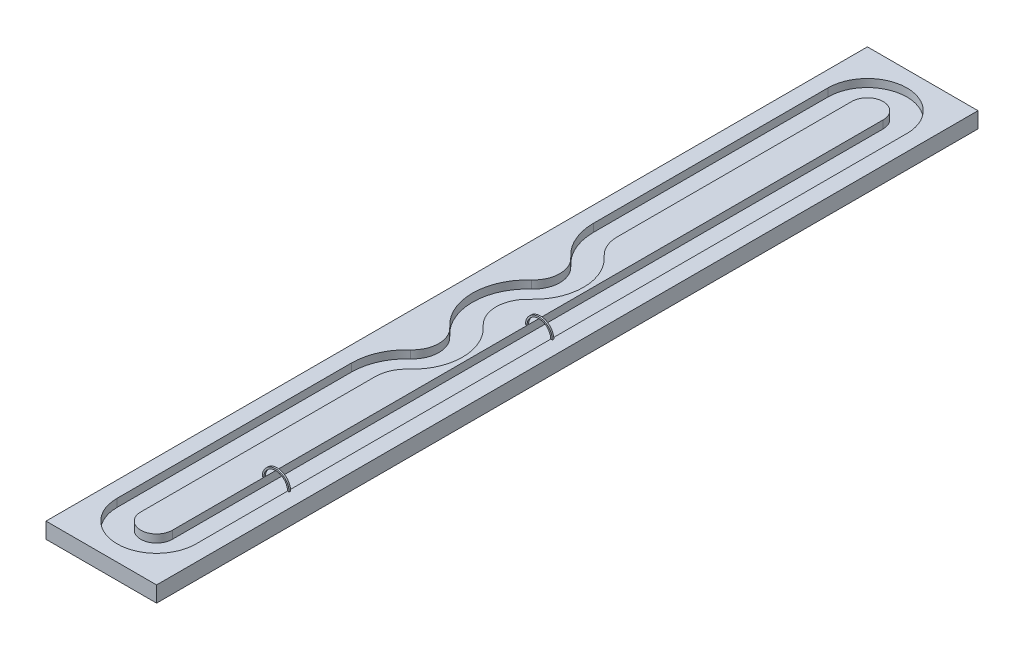
ISO-10303-21;
HEADER;
FILE_DESCRIPTION(('STEP AP214'),'2;1');
FILE_NAME('part.step','',(''),(''),'','','');
FILE_SCHEMA(('AUTOMOTIVE_DESIGN { 1 0 10303 214 1 1 1 1 }'));
ENDSEC;
DATA;
#1=APPLICATION_CONTEXT('core data for automotive mechanical design processes');
#2=APPLICATION_PROTOCOL_DEFINITION('international standard','automotive_design',2000,#1);
#3=PRODUCT_CONTEXT('',#1,'mechanical');
#4=PRODUCT('Part','Part','',(#3));
#5=PRODUCT_RELATED_PRODUCT_CATEGORY('part','',(#4));
#6=PRODUCT_DEFINITION_FORMATION('','',#4);
#7=PRODUCT_DEFINITION_CONTEXT('part definition',#1,'design');
#8=PRODUCT_DEFINITION('design','',#6,#7);
#9=PRODUCT_DEFINITION_SHAPE('','',#8);
#10=(LENGTH_UNIT() NAMED_UNIT(*) SI_UNIT(.MILLI.,.METRE.));
#11=(NAMED_UNIT(*) PLANE_ANGLE_UNIT() SI_UNIT($,.RADIAN.));
#12=(NAMED_UNIT(*) SI_UNIT($,.STERADIAN.) SOLID_ANGLE_UNIT());
#13=UNCERTAINTY_MEASURE_WITH_UNIT(LENGTH_MEASURE(1.E-05),#10,'distance_accuracy_value','');
#14=(GEOMETRIC_REPRESENTATION_CONTEXT(3) GLOBAL_UNCERTAINTY_ASSIGNED_CONTEXT((#13)) GLOBAL_UNIT_ASSIGNED_CONTEXT((#10,
#11,#12)) REPRESENTATION_CONTEXT('',''));
#15=CARTESIAN_POINT('',(0.,0.,0.));
#16=DIRECTION('',(0.,0.,1.));
#17=DIRECTION('',(1.,0.,0.));
#18=AXIS2_PLACEMENT_3D('',#15,#16,#17);
#19=CARTESIAN_POINT('',(-3500.00000000001,500.,-51000.));
#20=DIRECTION('',(1.,0.,0.));
#21=DIRECTION('',(0.,0.,-1.));
#22=AXIS2_PLACEMENT_3D('',#19,#20,#21);
#23=PLANE('',#22);
#24=DIRECTION('',(0.,0.,1.));
#25=VECTOR('',#24,1.);
#26=CARTESIAN_POINT('',(-3500.00000000001,-500.,-51000.));
#27=LINE('',#26,#25);
#28=CARTESIAN_POINT('',(-3500.00000000001,-500.,-51000.));
#29=VERTEX_POINT('',#28);
#30=CARTESIAN_POINT('',(-3500.,-500.,1000.));
#31=VERTEX_POINT('',#30);
#32=EDGE_CURVE('E393',#29,#31,#27,.T.);
#33=ORIENTED_EDGE('',*,*,#32,.T.);
#34=DIRECTION('',(0.,-1.,0.));
#35=VECTOR('',#34,1.);
#36=CARTESIAN_POINT('',(-3500.,500.,1000.));
#37=LINE('',#36,#35);
#38=CARTESIAN_POINT('',(-3500.,500.,1000.));
#39=VERTEX_POINT('',#38);
#40=EDGE_CURVE('E11',#39,#31,#37,.T.);
#41=ORIENTED_EDGE('',*,*,#40,.F.);
#42=DIRECTION('',(0.,0.,1.));
#43=VECTOR('',#42,1.);
#44=CARTESIAN_POINT('',(-3500.00000000001,500.,-51000.));
#45=LINE('',#44,#43);
#46=CARTESIAN_POINT('',(-3500.00000000001,500.,-51000.));
#47=VERTEX_POINT('',#46);
#48=EDGE_CURVE('E413',#47,#39,#45,.T.);
#49=ORIENTED_EDGE('',*,*,#48,.F.);
#50=DIRECTION('',(0.,-1.,0.));
#51=VECTOR('',#50,1.);
#52=CARTESIAN_POINT('',(-3500.00000000001,500.,-51000.));
#53=LINE('',#52,#51);
#54=EDGE_CURVE('E423',#47,#29,#53,.T.);
#55=ORIENTED_EDGE('',*,*,#54,.T.);
#56=EDGE_LOOP('',(#33,#41,#49,#55));
#57=FACE_BOUND('',#56,.T.);
#58=ADVANCED_FACE('F33',(#57),#23,.F.);
#59=CARTESIAN_POINT('',(-3500.,500.,1000.));
#60=DIRECTION('',(0.,0.,-1.));
#61=DIRECTION('',(-1.,0.,0.));
#62=AXIS2_PLACEMENT_3D('',#59,#60,#61);
#63=PLANE('',#62);
#64=DIRECTION('',(1.,0.,0.));
#65=VECTOR('',#64,1.);
#66=CARTESIAN_POINT('',(-3500.,-500.,1000.));
#67=LINE('',#66,#65);
#68=CARTESIAN_POINT('',(3500.,-500.,1000.));
#69=VERTEX_POINT('',#68);
#70=EDGE_CURVE('E426',#31,#69,#67,.T.);
#71=ORIENTED_EDGE('',*,*,#70,.T.);
#72=DIRECTION('',(0.,-1.,0.));
#73=VECTOR('',#72,1.);
#74=CARTESIAN_POINT('',(3500.,500.,1000.));
#75=LINE('',#74,#73);
#76=CARTESIAN_POINT('',(3500.,500.,1000.));
#77=VERTEX_POINT('',#76);
#78=EDGE_CURVE('E40',#77,#69,#75,.T.);
#79=ORIENTED_EDGE('',*,*,#78,.F.);
#80=DIRECTION('',(1.,0.,0.));
#81=VECTOR('',#80,1.);
#82=CARTESIAN_POINT('',(-3500.,500.,1000.));
#83=LINE('',#82,#81);
#84=EDGE_CURVE('E416',#39,#77,#83,.T.);
#85=ORIENTED_EDGE('',*,*,#84,.F.);
#86=ORIENTED_EDGE('',*,*,#40,.T.);
#87=EDGE_LOOP('',(#71,#79,#85,#86));
#88=FACE_BOUND('',#87,.T.);
#89=ADVANCED_FACE('F456',(#88),#63,.F.);
#90=CARTESIAN_POINT('',(3500.00000000001,500.,-51000.));
#91=DIRECTION('',(-1.,0.,0.));
#92=DIRECTION('',(0.,0.,1.));
#93=AXIS2_PLACEMENT_3D('',#90,#91,#92);
#94=PLANE('',#93);
#95=DIRECTION('',(0.,0.,-1.));
#96=VECTOR('',#95,1.);
#97=CARTESIAN_POINT('',(3500.00000000001,-500.,-51000.));
#98=LINE('',#97,#96);
#99=CARTESIAN_POINT('',(3500.00000000001,-500.,-51000.));
#100=VERTEX_POINT('',#99);
#101=EDGE_CURVE('E428',#69,#100,#98,.T.);
#102=ORIENTED_EDGE('',*,*,#101,.T.);
#103=DIRECTION('',(0.,-1.,0.));
#104=VECTOR('',#103,1.);
#105=CARTESIAN_POINT('',(3500.00000000001,500.,-51000.));
#106=LINE('',#105,#104);
#107=CARTESIAN_POINT('',(3500.00000000001,500.,-51000.));
#108=VERTEX_POINT('',#107);
#109=EDGE_CURVE('E433',#108,#100,#106,.T.);
#110=ORIENTED_EDGE('',*,*,#109,.F.);
#111=DIRECTION('',(0.,0.,-1.));
#112=VECTOR('',#111,1.);
#113=CARTESIAN_POINT('',(3500.00000000001,500.,-51000.));
#114=LINE('',#113,#112);
#115=EDGE_CURVE('E419',#77,#108,#114,.T.);
#116=ORIENTED_EDGE('',*,*,#115,.F.);
#117=ORIENTED_EDGE('',*,*,#78,.T.);
#118=EDGE_LOOP('',(#102,#110,#116,#117));
#119=FACE_BOUND('',#118,.T.);
#120=ADVANCED_FACE('F440',(#119),#94,.F.);
#121=CARTESIAN_POINT('',(-3500.00000000001,500.,-51000.));
#122=DIRECTION('',(0.,0.,1.));
#123=DIRECTION('',(1.,0.,0.));
#124=AXIS2_PLACEMENT_3D('',#121,#122,#123);
#125=PLANE('',#124);
#126=DIRECTION('',(-1.,0.,0.));
#127=VECTOR('',#126,1.);
#128=CARTESIAN_POINT('',(-3500.00000000001,-500.,-51000.));
#129=LINE('',#128,#127);
#130=EDGE_CURVE('E417',#100,#29,#129,.T.);
#131=ORIENTED_EDGE('',*,*,#130,.T.);
#132=ORIENTED_EDGE('',*,*,#54,.F.);
#133=DIRECTION('',(-1.,0.,0.));
#134=VECTOR('',#133,1.);
#135=CARTESIAN_POINT('',(-3500.00000000001,500.,-51000.));
#136=LINE('',#135,#134);
#137=EDGE_CURVE('E421',#108,#47,#136,.T.);
#138=ORIENTED_EDGE('',*,*,#137,.F.);
#139=ORIENTED_EDGE('',*,*,#109,.T.);
#140=EDGE_LOOP('',(#131,#132,#138,#139));
#141=FACE_BOUND('',#140,.T.);
#142=ADVANCED_FACE('F449',(#141),#125,.F.);
#143=CARTESIAN_POINT('',(0.,500.,0.));
#144=DIRECTION('',(0.,1.,0.));
#145=DIRECTION('',(0.,0.,1.));
#146=AXIS2_PLACEMENT_3D('',#143,#144,#145);
#147=PLANE('',#146);
#148=DIRECTION('',(-1.,0.,0.));
#149=VECTOR('',#148,1.);
#150=CARTESIAN_POINT('',(2600.00000000016,500.,-8390.00000000002));
#151=LINE('',#150,#149);
#152=CARTESIAN_POINT('',(2600.00000000016,500.,-8390.00000000002));
#153=VERTEX_POINT('',#152);
#154=CARTESIAN_POINT('',(2500.,500.,-8390.00000000002));
#155=VERTEX_POINT('',#154);
#156=EDGE_CURVE('E244',#153,#155,#151,.T.);
#157=ORIENTED_EDGE('',*,*,#156,.F.);
#158=DIRECTION('',(0.,0.,1.));
#159=VECTOR('',#158,1.);
#160=CARTESIAN_POINT('',(2600.00000000016,500.,-8390.00000000002));
#161=LINE('',#160,#159);
#162=CARTESIAN_POINT('',(2600.00000000016,500.,-8290.00000000002));
#163=VERTEX_POINT('',#162);
#164=EDGE_CURVE('E801',#153,#163,#161,.T.);
#165=ORIENTED_EDGE('',*,*,#164,.T.);
#166=DIRECTION('',(-1.,0.,0.));
#167=VECTOR('',#166,1.);
#168=CARTESIAN_POINT('',(2600.00000000016,500.,-8290.00000000002));
#169=LINE('',#168,#167);
#170=CARTESIAN_POINT('',(2500.00000000016,500.,-8290.00000000002));
#171=VERTEX_POINT('',#170);
#172=EDGE_CURVE('E246',#163,#171,#169,.T.);
#173=ORIENTED_EDGE('',*,*,#172,.T.);
#174=DIRECTION('',(0.,0.,-1.));
#175=VECTOR('',#174,1.);
#176=CARTESIAN_POINT('',(2500.,500.,-2500.));
#177=LINE('',#176,#175);
#178=CARTESIAN_POINT('',(2500.,500.,-2500.));
#179=VERTEX_POINT('',#178);
#180=EDGE_CURVE('E364',#179,#171,#177,.T.);
#181=ORIENTED_EDGE('',*,*,#180,.F.);
#182=CARTESIAN_POINT('',(0.,500.,-2500.));
#183=DIRECTION('',(0.,1.,0.));
#184=DIRECTION('',(0.,0.,1.));
#185=AXIS2_PLACEMENT_3D('',#182,#183,#184);
#186=CIRCLE('',#185,2500.);
#187=CARTESIAN_POINT('',(-2500.,500.,-2500.));
#188=VERTEX_POINT('',#187);
#189=EDGE_CURVE('E309',#188,#179,#186,.T.);
#190=ORIENTED_EDGE('',*,*,#189,.F.);
#191=DIRECTION('',(0.,0.,1.));
#192=VECTOR('',#191,1.);
#193=CARTESIAN_POINT('',(-2500.,500.,-17340.));
#194=LINE('',#193,#192);
#195=CARTESIAN_POINT('',(-2500.,500.,-17340.));
#196=VERTEX_POINT('',#195);
#197=EDGE_CURVE('E334',#196,#188,#194,.T.);
#198=ORIENTED_EDGE('',*,*,#197,.F.);
#199=CARTESIAN_POINT('',(991.895086607276,500.,-17340.));
#200=DIRECTION('',(0.,1.,0.));
#201=DIRECTION('',(0.,0.,1.));
#202=AXIS2_PLACEMENT_3D('',#199,#200,#201);
#203=CIRCLE('',#202,3491.89508660727);
#204=CARTESIAN_POINT('',(-1352.10190587398,500.,-19928.2444620072));
#205=VERTEX_POINT('',#204);
#206=EDGE_CURVE('E386',#205,#196,#203,.T.);
#207=ORIENTED_EDGE('',*,*,#206,.F.);
#208=CARTESIAN_POINT('',(-2476.67544951634,500.,-21170.));
#209=DIRECTION('',(0.,-1.,0.));
#210=DIRECTION('',(0.,0.,-1.));
#211=AXIS2_PLACEMENT_3D('',#208,#209,#210);
#212=CIRCLE('',#211,1675.29772613592);
#213=CARTESIAN_POINT('',(-1352.10190587398,500.,-22411.7555379928));
#214=VERTEX_POINT('',#213);
#215=EDGE_CURVE('E383',#214,#205,#212,.T.);
#216=ORIENTED_EDGE('',*,*,#215,.F.);
#217=CARTESIAN_POINT('',(991.895086607281,500.,-25000.));
#218=DIRECTION('',(0.,1.,0.));
#219=DIRECTION('',(0.,0.,1.));
#220=AXIS2_PLACEMENT_3D('',#217,#218,#219);
#221=CIRCLE('',#220,3491.89508660728);
#222=CARTESIAN_POINT('',(-1352.10190587398,500.,-27588.2444620072));
#223=VERTEX_POINT('',#222);
#224=EDGE_CURVE('E380',#223,#214,#221,.T.);
#225=ORIENTED_EDGE('',*,*,#224,.F.);
#226=CARTESIAN_POINT('',(-2476.67544951634,500.,-28830.));
#227=DIRECTION('',(0.,-1.,0.));
#228=DIRECTION('',(0.,0.,-1.));
#229=AXIS2_PLACEMENT_3D('',#226,#227,#228);
#230=CIRCLE('',#229,1675.29772613592);
#231=CARTESIAN_POINT('',(-1352.10190587398,500.,-30071.7555379928));
#232=VERTEX_POINT('',#231);
#233=EDGE_CURVE('E377',#232,#223,#230,.T.);
#234=ORIENTED_EDGE('',*,*,#233,.F.);
#235=CARTESIAN_POINT('',(991.895086607304,500.,-32660.));
#236=DIRECTION('',(0.,1.,0.));
#237=DIRECTION('',(0.,0.,1.));
#238=AXIS2_PLACEMENT_3D('',#235,#236,#237);
#239=CIRCLE('',#238,3491.89508660731);
#240=CARTESIAN_POINT('',(-2500.,500.,-32660.));
#241=VERTEX_POINT('',#240);
#242=EDGE_CURVE('E374',#241,#232,#239,.T.);
#243=ORIENTED_EDGE('',*,*,#242,.F.);
#244=DIRECTION('',(0.,0.,1.));
#245=VECTOR('',#244,1.);
#246=CARTESIAN_POINT('',(-2500.,500.,-47500.));
#247=LINE('',#246,#245);
#248=CARTESIAN_POINT('',(-2500.,500.,-47500.));
#249=VERTEX_POINT('',#248);
#250=EDGE_CURVE('E371',#249,#241,#247,.T.);
#251=ORIENTED_EDGE('',*,*,#250,.F.);
#252=CARTESIAN_POINT('',(-3.99680288865056E-12,500.,-47500.));
#253=DIRECTION('',(0.,1.,0.));
#254=DIRECTION('',(0.,0.,1.));
#255=AXIS2_PLACEMENT_3D('',#252,#253,#254);
#256=CIRCLE('',#255,2500.);
#257=CARTESIAN_POINT('',(2500.,500.,-47500.));
#258=VERTEX_POINT('',#257);
#259=EDGE_CURVE('E367',#258,#249,#256,.T.);
#260=ORIENTED_EDGE('',*,*,#259,.F.);
#261=CARTESIAN_POINT('',(2500.,500.,-25050.));
#262=VERTEX_POINT('',#261);
#263=EDGE_CURVE('E363',#262,#258,#177,.T.);
#264=ORIENTED_EDGE('',*,*,#263,.F.);
#265=DIRECTION('',(-1.,0.,0.));
#266=VECTOR('',#265,1.);
#267=CARTESIAN_POINT('',(2600.00000000015,500.,-25050.));
#268=LINE('',#267,#266);
#269=CARTESIAN_POINT('',(2600.00000000015,500.,-25050.));
#270=VERTEX_POINT('',#269);
#271=EDGE_CURVE('E834',#270,#262,#268,.T.);
#272=ORIENTED_EDGE('',*,*,#271,.F.);
#273=DIRECTION('',(0.,0.,1.));
#274=VECTOR('',#273,1.);
#275=CARTESIAN_POINT('',(2600.00000000015,500.,-25050.));
#276=LINE('',#275,#274);
#277=CARTESIAN_POINT('',(2600.00000000015,500.,-24950.));
#278=VERTEX_POINT('',#277);
#279=EDGE_CURVE('E833',#270,#278,#276,.T.);
#280=ORIENTED_EDGE('',*,*,#279,.T.);
#281=DIRECTION('',(-1.,0.,0.));
#282=VECTOR('',#281,1.);
#283=CARTESIAN_POINT('',(2600.00000000015,500.,-24950.));
#284=LINE('',#283,#282);
#285=CARTESIAN_POINT('',(2500.00000000015,500.,-24950.));
#286=VERTEX_POINT('',#285);
#287=EDGE_CURVE('E837',#278,#286,#284,.T.);
#288=ORIENTED_EDGE('',*,*,#287,.T.);
#289=EDGE_CURVE('E368',#155,#286,#177,.T.);
#290=ORIENTED_EDGE('',*,*,#289,.F.);
#291=EDGE_LOOP('',(#157,#165,#173,#181,#190,#198,#207,#216,#225,#234,#243,#251,#260,#264,#272,
#280,#288,#290));
#292=FACE_BOUND('',#291,.T.);
#293=ORIENTED_EDGE('',*,*,#48,.T.);
#294=ORIENTED_EDGE('',*,*,#84,.T.);
#295=ORIENTED_EDGE('',*,*,#115,.T.);
#296=ORIENTED_EDGE('',*,*,#137,.T.);
#297=EDGE_LOOP('',(#293,#294,#295,#296));
#298=FACE_BOUND('',#297,.T.);
#299=ADVANCED_FACE('F455',(#292,#298),#147,.T.);
#300=CARTESIAN_POINT('',(0.,-500.,0.));
#301=DIRECTION('',(0.,1.,0.));
#302=DIRECTION('',(0.,0.,1.));
#303=AXIS2_PLACEMENT_3D('',#300,#301,#302);
#304=PLANE('',#303);
#305=ORIENTED_EDGE('',*,*,#32,.F.);
#306=ORIENTED_EDGE('',*,*,#130,.F.);
#307=ORIENTED_EDGE('',*,*,#101,.F.);
#308=ORIENTED_EDGE('',*,*,#70,.F.);
#309=EDGE_LOOP('',(#305,#306,#307,#308));
#310=FACE_BOUND('',#309,.T.);
#311=ADVANCED_FACE('F446',(#310),#304,.F.);
#312=CARTESIAN_POINT('',(0.,0.,-2500.));
#313=DIRECTION('',(0.,1.,0.));
#314=DIRECTION('',(0.,0.,1.));
#315=AXIS2_PLACEMENT_3D('',#312,#313,#314);
#316=CYLINDRICAL_SURFACE('',#315,2500.);
#317=ORIENTED_EDGE('',*,*,#189,.T.);
#318=DIRECTION('',(0.,1.,0.));
#319=VECTOR('',#318,1.);
#320=CARTESIAN_POINT('',(2500.,0.,-2500.));
#321=LINE('',#320,#319);
#322=CARTESIAN_POINT('',(2500.,0.,-2500.));
#323=VERTEX_POINT('',#322);
#324=EDGE_CURVE('E361',#323,#179,#321,.T.);
#325=ORIENTED_EDGE('',*,*,#324,.F.);
#326=CARTESIAN_POINT('',(0.,0.,-2500.));
#327=DIRECTION('',(0.,1.,0.));
#328=DIRECTION('',(0.,0.,1.));
#329=AXIS2_PLACEMENT_3D('',#326,#327,#328);
#330=CIRCLE('',#329,2500.);
#331=CARTESIAN_POINT('',(-2500.,0.,-2500.));
#332=VERTEX_POINT('',#331);
#333=EDGE_CURVE('E330',#332,#323,#330,.T.);
#334=ORIENTED_EDGE('',*,*,#333,.F.);
#335=DIRECTION('',(0.,1.,0.));
#336=VECTOR('',#335,1.);
#337=CARTESIAN_POINT('',(-2500.,0.,-2500.));
#338=LINE('',#337,#336);
#339=EDGE_CURVE('E391',#332,#188,#338,.T.);
#340=ORIENTED_EDGE('',*,*,#339,.T.);
#341=EDGE_LOOP('',(#317,#325,#334,#340));
#342=FACE_BOUND('',#341,.T.);
#343=ADVANCED_FACE('F468',(#342),#316,.F.);
#344=CARTESIAN_POINT('',(-2500.,0.,-17340.));
#345=DIRECTION('',(-1.,0.,0.));
#346=DIRECTION('',(0.,0.,1.));
#347=AXIS2_PLACEMENT_3D('',#344,#345,#346);
#348=PLANE('',#347);
#349=ORIENTED_EDGE('',*,*,#197,.T.);
#350=ORIENTED_EDGE('',*,*,#339,.F.);
#351=DIRECTION('',(0.,0.,1.));
#352=VECTOR('',#351,1.);
#353=CARTESIAN_POINT('',(-2500.,0.,-17340.));
#354=LINE('',#353,#352);
#355=CARTESIAN_POINT('',(-2500.,0.,-17340.));
#356=VERTEX_POINT('',#355);
#357=EDGE_CURVE('E358',#356,#332,#354,.T.);
#358=ORIENTED_EDGE('',*,*,#357,.F.);
#359=DIRECTION('',(0.,1.,0.));
#360=VECTOR('',#359,1.);
#361=CARTESIAN_POINT('',(-2500.,0.,-17340.));
#362=LINE('',#361,#360);
#363=EDGE_CURVE('E394',#356,#196,#362,.T.);
#364=ORIENTED_EDGE('',*,*,#363,.T.);
#365=EDGE_LOOP('',(#349,#350,#358,#364));
#366=FACE_BOUND('',#365,.T.);
#367=ADVANCED_FACE('F474',(#366),#348,.F.);
#368=CARTESIAN_POINT('',(991.895086607276,0.,-17340.));
#369=DIRECTION('',(0.,1.,0.));
#370=DIRECTION('',(0.,0.,1.));
#371=AXIS2_PLACEMENT_3D('',#368,#369,#370);
#372=CYLINDRICAL_SURFACE('',#371,3491.89508660727);
#373=ORIENTED_EDGE('',*,*,#206,.T.);
#374=ORIENTED_EDGE('',*,*,#363,.F.);
#375=CARTESIAN_POINT('',(991.895086607276,0.,-17340.));
#376=DIRECTION('',(0.,1.,0.));
#377=DIRECTION('',(0.,0.,1.));
#378=AXIS2_PLACEMENT_3D('',#375,#376,#377);
#379=CIRCLE('',#378,3491.89508660727);
#380=CARTESIAN_POINT('',(-1352.10190587398,0.,-19928.2444620072));
#381=VERTEX_POINT('',#380);
#382=EDGE_CURVE('E355',#381,#356,#379,.T.);
#383=ORIENTED_EDGE('',*,*,#382,.F.);
#384=DIRECTION('',(0.,1.,0.));
#385=VECTOR('',#384,1.);
#386=CARTESIAN_POINT('',(-1352.10190587398,0.,-19928.2444620072));
#387=LINE('',#386,#385);
#388=EDGE_CURVE('E396',#381,#205,#387,.T.);
#389=ORIENTED_EDGE('',*,*,#388,.T.);
#390=EDGE_LOOP('',(#373,#374,#383,#389));
#391=FACE_BOUND('',#390,.T.);
#392=ADVANCED_FACE('F504',(#391),#372,.F.);
#393=CARTESIAN_POINT('',(-2476.67544951634,0.,-21170.));
#394=DIRECTION('',(0.,1.,0.));
#395=DIRECTION('',(0.,0.,1.));
#396=AXIS2_PLACEMENT_3D('',#393,#394,#395);
#397=CYLINDRICAL_SURFACE('',#396,1675.29772613592);
#398=ORIENTED_EDGE('',*,*,#215,.T.);
#399=ORIENTED_EDGE('',*,*,#388,.F.);
#400=CARTESIAN_POINT('',(-2476.67544951634,0.,-21170.));
#401=DIRECTION('',(0.,-1.,0.));
#402=DIRECTION('',(0.,0.,-1.));
#403=AXIS2_PLACEMENT_3D('',#400,#401,#402);
#404=CIRCLE('',#403,1675.29772613592);
#405=CARTESIAN_POINT('',(-1352.10190587398,0.,-22411.7555379928));
#406=VERTEX_POINT('',#405);
#407=EDGE_CURVE('E352',#406,#381,#404,.T.);
#408=ORIENTED_EDGE('',*,*,#407,.F.);
#409=DIRECTION('',(0.,1.,0.));
#410=VECTOR('',#409,1.);
#411=CARTESIAN_POINT('',(-1352.10190587398,0.,-22411.7555379928));
#412=LINE('',#411,#410);
#413=EDGE_CURVE('E398',#406,#214,#412,.T.);
#414=ORIENTED_EDGE('',*,*,#413,.T.);
#415=EDGE_LOOP('',(#398,#399,#408,#414));
#416=FACE_BOUND('',#415,.T.);
#417=ADVANCED_FACE('F500',(#416),#397,.T.);
#418=CARTESIAN_POINT('',(991.895086607281,0.,-25000.));
#419=DIRECTION('',(0.,1.,0.));
#420=DIRECTION('',(0.,0.,1.));
#421=AXIS2_PLACEMENT_3D('',#418,#419,#420);
#422=CYLINDRICAL_SURFACE('',#421,3491.89508660728);
#423=ORIENTED_EDGE('',*,*,#224,.T.);
#424=ORIENTED_EDGE('',*,*,#413,.F.);
#425=CARTESIAN_POINT('',(991.895086607281,0.,-25000.));
#426=DIRECTION('',(0.,1.,0.));
#427=DIRECTION('',(0.,0.,1.));
#428=AXIS2_PLACEMENT_3D('',#425,#426,#427);
#429=CIRCLE('',#428,3491.89508660728);
#430=CARTESIAN_POINT('',(-1352.10190587398,0.,-27588.2444620072));
#431=VERTEX_POINT('',#430);
#432=EDGE_CURVE('E349',#431,#406,#429,.T.);
#433=ORIENTED_EDGE('',*,*,#432,.F.);
#434=DIRECTION('',(0.,1.,0.));
#435=VECTOR('',#434,1.);
#436=CARTESIAN_POINT('',(-1352.10190587398,0.,-27588.2444620072));
#437=LINE('',#436,#435);
#438=EDGE_CURVE('E400',#431,#223,#437,.T.);
#439=ORIENTED_EDGE('',*,*,#438,.T.);
#440=EDGE_LOOP('',(#423,#424,#433,#439));
#441=FACE_BOUND('',#440,.T.);
#442=ADVANCED_FACE('F496',(#441),#422,.F.);
#443=CARTESIAN_POINT('',(-2476.67544951634,0.,-28830.));
#444=DIRECTION('',(0.,1.,0.));
#445=DIRECTION('',(0.,0.,1.));
#446=AXIS2_PLACEMENT_3D('',#443,#444,#445);
#447=CYLINDRICAL_SURFACE('',#446,1675.29772613592);
#448=ORIENTED_EDGE('',*,*,#233,.T.);
#449=ORIENTED_EDGE('',*,*,#438,.F.);
#450=CARTESIAN_POINT('',(-2476.67544951634,0.,-28830.));
#451=DIRECTION('',(0.,-1.,0.));
#452=DIRECTION('',(0.,0.,-1.));
#453=AXIS2_PLACEMENT_3D('',#450,#451,#452);
#454=CIRCLE('',#453,1675.29772613592);
#455=CARTESIAN_POINT('',(-1352.10190587398,0.,-30071.7555379928));
#456=VERTEX_POINT('',#455);
#457=EDGE_CURVE('E346',#456,#431,#454,.T.);
#458=ORIENTED_EDGE('',*,*,#457,.F.);
#459=DIRECTION('',(0.,1.,0.));
#460=VECTOR('',#459,1.);
#461=CARTESIAN_POINT('',(-1352.10190587398,0.,-30071.7555379928));
#462=LINE('',#461,#460);
#463=EDGE_CURVE('E402',#456,#232,#462,.T.);
#464=ORIENTED_EDGE('',*,*,#463,.T.);
#465=EDGE_LOOP('',(#448,#449,#458,#464));
#466=FACE_BOUND('',#465,.T.);
#467=ADVANCED_FACE('F492',(#466),#447,.T.);
#468=CARTESIAN_POINT('',(991.895086607304,0.,-32660.));
#469=DIRECTION('',(0.,1.,0.));
#470=DIRECTION('',(0.,0.,1.));
#471=AXIS2_PLACEMENT_3D('',#468,#469,#470);
#472=CYLINDRICAL_SURFACE('',#471,3491.89508660731);
#473=ORIENTED_EDGE('',*,*,#242,.T.);
#474=ORIENTED_EDGE('',*,*,#463,.F.);
#475=CARTESIAN_POINT('',(991.895086607304,0.,-32660.));
#476=DIRECTION('',(0.,1.,0.));
#477=DIRECTION('',(0.,0.,1.));
#478=AXIS2_PLACEMENT_3D('',#475,#476,#477);
#479=CIRCLE('',#478,3491.89508660731);
#480=CARTESIAN_POINT('',(-2500.,0.,-32660.));
#481=VERTEX_POINT('',#480);
#482=EDGE_CURVE('E343',#481,#456,#479,.T.);
#483=ORIENTED_EDGE('',*,*,#482,.F.);
#484=DIRECTION('',(0.,1.,0.));
#485=VECTOR('',#484,1.);
#486=CARTESIAN_POINT('',(-2500.,0.,-32660.));
#487=LINE('',#486,#485);
#488=EDGE_CURVE('E404',#481,#241,#487,.T.);
#489=ORIENTED_EDGE('',*,*,#488,.T.);
#490=EDGE_LOOP('',(#473,#474,#483,#489));
#491=FACE_BOUND('',#490,.T.);
#492=ADVANCED_FACE('F488',(#491),#472,.F.);
#493=CARTESIAN_POINT('',(-2500.,0.,-47500.));
#494=DIRECTION('',(-1.,0.,0.));
#495=DIRECTION('',(0.,0.,1.));
#496=AXIS2_PLACEMENT_3D('',#493,#494,#495);
#497=PLANE('',#496);
#498=ORIENTED_EDGE('',*,*,#250,.T.);
#499=ORIENTED_EDGE('',*,*,#488,.F.);
#500=DIRECTION('',(0.,0.,1.));
#501=VECTOR('',#500,1.);
#502=CARTESIAN_POINT('',(-2500.,0.,-47500.));
#503=LINE('',#502,#501);
#504=CARTESIAN_POINT('',(-2500.,0.,-47500.));
#505=VERTEX_POINT('',#504);
#506=EDGE_CURVE('E340',#505,#481,#503,.T.);
#507=ORIENTED_EDGE('',*,*,#506,.F.);
#508=DIRECTION('',(0.,1.,0.));
#509=VECTOR('',#508,1.);
#510=CARTESIAN_POINT('',(-2500.,0.,-47500.));
#511=LINE('',#510,#509);
#512=EDGE_CURVE('E406',#505,#249,#511,.T.);
#513=ORIENTED_EDGE('',*,*,#512,.T.);
#514=EDGE_LOOP('',(#498,#499,#507,#513));
#515=FACE_BOUND('',#514,.T.);
#516=ADVANCED_FACE('F484',(#515),#497,.F.);
#517=CARTESIAN_POINT('',(-3.99680288865056E-12,0.,-47500.));
#518=DIRECTION('',(0.,1.,0.));
#519=DIRECTION('',(0.,0.,1.));
#520=AXIS2_PLACEMENT_3D('',#517,#518,#519);
#521=CYLINDRICAL_SURFACE('',#520,2500.);
#522=ORIENTED_EDGE('',*,*,#259,.T.);
#523=ORIENTED_EDGE('',*,*,#512,.F.);
#524=CARTESIAN_POINT('',(-3.99680288865056E-12,0.,-47500.));
#525=DIRECTION('',(0.,1.,0.));
#526=DIRECTION('',(0.,0.,1.));
#527=AXIS2_PLACEMENT_3D('',#524,#525,#526);
#528=CIRCLE('',#527,2500.);
#529=CARTESIAN_POINT('',(2500.,0.,-47500.));
#530=VERTEX_POINT('',#529);
#531=EDGE_CURVE('E337',#530,#505,#528,.T.);
#532=ORIENTED_EDGE('',*,*,#531,.F.);
#533=DIRECTION('',(0.,1.,0.));
#534=VECTOR('',#533,1.);
#535=CARTESIAN_POINT('',(2500.,0.,-47500.));
#536=LINE('',#535,#534);
#537=EDGE_CURVE('E408',#530,#258,#536,.T.);
#538=ORIENTED_EDGE('',*,*,#537,.T.);
#539=EDGE_LOOP('',(#522,#523,#532,#538));
#540=FACE_BOUND('',#539,.T.);
#541=ADVANCED_FACE('F480',(#540),#521,.F.);
#542=CARTESIAN_POINT('',(2500.,0.,-2500.));
#543=DIRECTION('',(1.,0.,0.));
#544=DIRECTION('',(0.,0.,-1.));
#545=AXIS2_PLACEMENT_3D('',#542,#543,#544);
#546=PLANE('',#545);
#547=ORIENTED_EDGE('',*,*,#180,.T.);
#548=DIRECTION('',(0.,0.,1.));
#549=VECTOR('',#548,1.);
#550=CARTESIAN_POINT('',(2500.00000000016,500.,-8390.00000000002));
#551=LINE('',#550,#549);
#552=EDGE_CURVE('E804',#155,#171,#551,.T.);
#553=ORIENTED_EDGE('',*,*,#552,.F.);
#554=ORIENTED_EDGE('',*,*,#289,.T.);
#555=DIRECTION('',(0.,0.,1.));
#556=VECTOR('',#555,1.);
#557=CARTESIAN_POINT('',(2500.00000000015,500.,-25050.));
#558=LINE('',#557,#556);
#559=EDGE_CURVE('E826',#262,#286,#558,.T.);
#560=ORIENTED_EDGE('',*,*,#559,.F.);
#561=ORIENTED_EDGE('',*,*,#263,.T.);
#562=ORIENTED_EDGE('',*,*,#537,.F.);
#563=DIRECTION('',(0.,0.,-1.));
#564=VECTOR('',#563,1.);
#565=CARTESIAN_POINT('',(2500.,0.,-2500.));
#566=LINE('',#565,#564);
#567=EDGE_CURVE('E333',#323,#530,#566,.T.);
#568=ORIENTED_EDGE('',*,*,#567,.F.);
#569=ORIENTED_EDGE('',*,*,#324,.T.);
#570=EDGE_LOOP('',(#547,#553,#554,#560,#561,#562,#568,#569));
#571=FACE_BOUND('',#570,.T.);
#572=ADVANCED_FACE('F476',(#571),#546,.F.);
#573=CARTESIAN_POINT('',(0.,0.,-2500.));
#574=DIRECTION('',(0.,1.,0.));
#575=DIRECTION('',(0.,0.,1.));
#576=AXIS2_PLACEMENT_3D('',#573,#574,#575);
#577=PLANE('',#576);
#578=DIRECTION('',(0.,0.,1.));
#579=VECTOR('',#578,1.);
#580=CARTESIAN_POINT('',(-999.999999999998,0.,-17340.));
#581=LINE('',#580,#579);
#582=CARTESIAN_POINT('',(-999.999999999997,0.,-17340.));
#583=VERTEX_POINT('',#582);
#584=CARTESIAN_POINT('',(-999.999999999999,0.,-2500.));
#585=VERTEX_POINT('',#584);
#586=EDGE_CURVE('E329',#583,#585,#581,.T.);
#587=ORIENTED_EDGE('',*,*,#586,.F.);
#588=CARTESIAN_POINT('',(991.895086607276,0.,-17340.));
#589=DIRECTION('',(0.,1.,0.));
#590=DIRECTION('',(0.,0.,1.));
#591=AXIS2_PLACEMENT_3D('',#588,#589,#590);
#592=CIRCLE('',#591,1991.89508660727);
#593=CARTESIAN_POINT('',(-345.200094245376,0.,-18816.4222002499));
#594=VERTEX_POINT('',#593);
#595=EDGE_CURVE('E877',#594,#583,#592,.T.);
#596=ORIENTED_EDGE('',*,*,#595,.F.);
#597=CARTESIAN_POINT('',(-2476.67544951634,0.,-21170.));
#598=DIRECTION('',(0.,-1.,0.));
#599=DIRECTION('',(0.,0.,-1.));
#600=AXIS2_PLACEMENT_3D('',#597,#598,#599);
#601=CIRCLE('',#600,3175.29772613592);
#602=CARTESIAN_POINT('',(-345.200094245379,0.,-23523.5777997501));
#603=VERTEX_POINT('',#602);
#604=EDGE_CURVE('E874',#603,#594,#601,.T.);
#605=ORIENTED_EDGE('',*,*,#604,.F.);
#606=CARTESIAN_POINT('',(991.895086607281,0.,-25000.));
#607=DIRECTION('',(0.,1.,0.));
#608=DIRECTION('',(0.,0.,1.));
#609=AXIS2_PLACEMENT_3D('',#606,#607,#608);
#610=CIRCLE('',#609,1991.89508660728);
#611=CARTESIAN_POINT('',(-345.200094245379,0.,-26476.4222002499));
#612=VERTEX_POINT('',#611);
#613=EDGE_CURVE('E871',#612,#603,#610,.T.);
#614=ORIENTED_EDGE('',*,*,#613,.F.);
#615=CARTESIAN_POINT('',(-2476.67544951634,0.,-28830.));
#616=DIRECTION('',(0.,-1.,0.));
#617=DIRECTION('',(0.,0.,-1.));
#618=AXIS2_PLACEMENT_3D('',#615,#616,#617);
#619=CIRCLE('',#618,3175.29772613592);
#620=CARTESIAN_POINT('',(-345.200094245376,0.,-31183.5777997501));
#621=VERTEX_POINT('',#620);
#622=EDGE_CURVE('E868',#621,#612,#619,.T.);
#623=ORIENTED_EDGE('',*,*,#622,.F.);
#624=CARTESIAN_POINT('',(991.895086607304,0.,-32660.));
#625=DIRECTION('',(0.,1.,0.));
#626=DIRECTION('',(0.,0.,1.));
#627=AXIS2_PLACEMENT_3D('',#624,#625,#626);
#628=CIRCLE('',#627,1991.89508660731);
#629=CARTESIAN_POINT('',(-1000.,0.,-32660.));
#630=VERTEX_POINT('',#629);
#631=EDGE_CURVE('E865',#630,#621,#628,.T.);
#632=ORIENTED_EDGE('',*,*,#631,.F.);
#633=DIRECTION('',(0.,0.,1.));
#634=VECTOR('',#633,1.);
#635=CARTESIAN_POINT('',(-1000.,0.,-47500.));
#636=LINE('',#635,#634);
#637=CARTESIAN_POINT('',(-1000.00000000001,0.,-47500.));
#638=VERTEX_POINT('',#637);
#639=EDGE_CURVE('E862',#638,#630,#636,.T.);
#640=ORIENTED_EDGE('',*,*,#639,.F.);
#641=CARTESIAN_POINT('',(-3.99680288865056E-12,0.,-47500.));
#642=DIRECTION('',(0.,1.,0.));
#643=DIRECTION('',(0.,0.,1.));
#644=AXIS2_PLACEMENT_3D('',#641,#642,#643);
#645=CIRCLE('',#644,1000.);
#646=CARTESIAN_POINT('',(1000.,0.,-47500.));
#647=VERTEX_POINT('',#646);
#648=EDGE_CURVE('E859',#647,#638,#645,.T.);
#649=ORIENTED_EDGE('',*,*,#648,.F.);
#650=DIRECTION('',(0.,0.,-1.));
#651=VECTOR('',#650,1.);
#652=CARTESIAN_POINT('',(1000.,0.,-2500.));
#653=LINE('',#652,#651);
#654=CARTESIAN_POINT('',(1000.,0.,-2500.));
#655=VERTEX_POINT('',#654);
#656=EDGE_CURVE('E856',#655,#647,#653,.T.);
#657=ORIENTED_EDGE('',*,*,#656,.F.);
#658=CARTESIAN_POINT('',(0.,0.,-2500.));
#659=DIRECTION('',(0.,1.,0.));
#660=DIRECTION('',(0.,0.,1.));
#661=AXIS2_PLACEMENT_3D('',#658,#659,#660);
#662=CIRCLE('',#661,1000.);
#663=EDGE_CURVE('E306',#585,#655,#662,.T.);
#664=ORIENTED_EDGE('',*,*,#663,.F.);
#665=EDGE_LOOP('',(#587,#596,#605,#614,#623,#632,#640,#649,#657,#664));
#666=FACE_BOUND('',#665,.T.);
#667=ORIENTED_EDGE('',*,*,#333,.T.);
#668=ORIENTED_EDGE('',*,*,#567,.T.);
#669=ORIENTED_EDGE('',*,*,#531,.T.);
#670=ORIENTED_EDGE('',*,*,#506,.T.);
#671=ORIENTED_EDGE('',*,*,#482,.T.);
#672=ORIENTED_EDGE('',*,*,#457,.T.);
#673=ORIENTED_EDGE('',*,*,#432,.T.);
#674=ORIENTED_EDGE('',*,*,#407,.T.);
#675=ORIENTED_EDGE('',*,*,#382,.T.);
#676=ORIENTED_EDGE('',*,*,#357,.T.);
#677=EDGE_LOOP('',(#667,#668,#669,#670,#671,#672,#673,#674,#675,#676));
#678=FACE_BOUND('',#677,.T.);
#679=ADVANCED_FACE('F479',(#666,#678),#577,.T.);
#680=CARTESIAN_POINT('',(0.,0.,-2500.));
#681=DIRECTION('',(0.,1.,0.));
#682=DIRECTION('',(0.,0.,1.));
#683=AXIS2_PLACEMENT_3D('',#680,#681,#682);
#684=CYLINDRICAL_SURFACE('',#683,1000.);
#685=CARTESIAN_POINT('',(0.,500.,-2500.));
#686=DIRECTION('',(0.,1.,0.));
#687=DIRECTION('',(0.,0.,1.));
#688=AXIS2_PLACEMENT_3D('',#685,#686,#687);
#689=CIRCLE('',#688,1000.);
#690=CARTESIAN_POINT('',(-999.999999999999,500.,-2500.));
#691=VERTEX_POINT('',#690);
#692=CARTESIAN_POINT('',(1000.,500.,-2500.));
#693=VERTEX_POINT('',#692);
#694=EDGE_CURVE('E279',#691,#693,#689,.T.);
#695=ORIENTED_EDGE('',*,*,#694,.F.);
#696=DIRECTION('',(0.,1.,0.));
#697=VECTOR('',#696,1.);
#698=CARTESIAN_POINT('',(-999.999999999999,0.,-2500.));
#699=LINE('',#698,#697);
#700=EDGE_CURVE('E307',#585,#691,#699,.T.);
#701=ORIENTED_EDGE('',*,*,#700,.F.);
#702=ORIENTED_EDGE('',*,*,#663,.T.);
#703=DIRECTION('',(0.,1.,0.));
#704=VECTOR('',#703,1.);
#705=CARTESIAN_POINT('',(1000.,0.,-2500.));
#706=LINE('',#705,#704);
#707=EDGE_CURVE('E327',#655,#693,#706,.T.);
#708=ORIENTED_EDGE('',*,*,#707,.T.);
#709=EDGE_LOOP('',(#695,#701,#702,#708));
#710=FACE_BOUND('',#709,.T.);
#711=ADVANCED_FACE('F514',(#710),#684,.T.);
#712=CARTESIAN_POINT('',(-999.999999999998,0.,-17340.));
#713=DIRECTION('',(-1.,0.,0.));
#714=DIRECTION('',(0.,0.,1.));
#715=AXIS2_PLACEMENT_3D('',#712,#713,#714);
#716=PLANE('',#715);
#717=DIRECTION('',(0.,0.,1.));
#718=VECTOR('',#717,1.);
#719=CARTESIAN_POINT('',(-999.999999999998,500.,-17340.));
#720=LINE('',#719,#718);
#721=CARTESIAN_POINT('',(-999.999999999997,500.,-17340.));
#722=VERTEX_POINT('',#721);
#723=EDGE_CURVE('E303',#722,#691,#720,.T.);
#724=ORIENTED_EDGE('',*,*,#723,.F.);
#725=DIRECTION('',(0.,1.,0.));
#726=VECTOR('',#725,1.);
#727=CARTESIAN_POINT('',(-999.999999999997,0.,-17340.));
#728=LINE('',#727,#726);
#729=EDGE_CURVE('E310',#583,#722,#728,.T.);
#730=ORIENTED_EDGE('',*,*,#729,.F.);
#731=ORIENTED_EDGE('',*,*,#586,.T.);
#732=ORIENTED_EDGE('',*,*,#700,.T.);
#733=EDGE_LOOP('',(#724,#730,#731,#732));
#734=FACE_BOUND('',#733,.T.);
#735=ADVANCED_FACE('F518',(#734),#716,.T.);
#736=CARTESIAN_POINT('',(991.895086607276,0.,-17340.));
#737=DIRECTION('',(0.,1.,0.));
#738=DIRECTION('',(0.,0.,1.));
#739=AXIS2_PLACEMENT_3D('',#736,#737,#738);
#740=CYLINDRICAL_SURFACE('',#739,1991.89508660727);
#741=CARTESIAN_POINT('',(991.895086607276,500.,-17340.));
#742=DIRECTION('',(0.,1.,0.));
#743=DIRECTION('',(0.,0.,1.));
#744=AXIS2_PLACEMENT_3D('',#741,#742,#743);
#745=CIRCLE('',#744,1991.89508660727);
#746=CARTESIAN_POINT('',(-345.200094245376,500.,-18816.4222002499));
#747=VERTEX_POINT('',#746);
#748=EDGE_CURVE('E300',#747,#722,#745,.T.);
#749=ORIENTED_EDGE('',*,*,#748,.F.);
#750=DIRECTION('',(0.,1.,0.));
#751=VECTOR('',#750,1.);
#752=CARTESIAN_POINT('',(-345.200094245376,0.,-18816.4222002499));
#753=LINE('',#752,#751);
#754=EDGE_CURVE('E312',#594,#747,#753,.T.);
#755=ORIENTED_EDGE('',*,*,#754,.F.);
#756=ORIENTED_EDGE('',*,*,#595,.T.);
#757=ORIENTED_EDGE('',*,*,#729,.T.);
#758=EDGE_LOOP('',(#749,#755,#756,#757));
#759=FACE_BOUND('',#758,.T.);
#760=ADVANCED_FACE('F545',(#759),#740,.T.);
#761=CARTESIAN_POINT('',(-2476.67544951634,0.,-21170.));
#762=DIRECTION('',(0.,1.,0.));
#763=DIRECTION('',(0.,0.,1.));
#764=AXIS2_PLACEMENT_3D('',#761,#762,#763);
#765=CYLINDRICAL_SURFACE('',#764,3175.29772613592);
#766=CARTESIAN_POINT('',(-2476.67544951634,500.,-21170.));
#767=DIRECTION('',(0.,-1.,0.));
#768=DIRECTION('',(0.,0.,-1.));
#769=AXIS2_PLACEMENT_3D('',#766,#767,#768);
#770=CIRCLE('',#769,3175.29772613592);
#771=CARTESIAN_POINT('',(-345.200094245379,500.,-23523.5777997501));
#772=VERTEX_POINT('',#771);
#773=EDGE_CURVE('E297',#772,#747,#770,.T.);
#774=ORIENTED_EDGE('',*,*,#773,.F.);
#775=DIRECTION('',(0.,1.,0.));
#776=VECTOR('',#775,1.);
#777=CARTESIAN_POINT('',(-345.200094245379,0.,-23523.5777997501));
#778=LINE('',#777,#776);
#779=EDGE_CURVE('E314',#603,#772,#778,.T.);
#780=ORIENTED_EDGE('',*,*,#779,.F.);
#781=ORIENTED_EDGE('',*,*,#604,.T.);
#782=ORIENTED_EDGE('',*,*,#754,.T.);
#783=EDGE_LOOP('',(#774,#780,#781,#782));
#784=FACE_BOUND('',#783,.T.);
#785=ADVANCED_FACE('F541',(#784),#765,.F.);
#786=CARTESIAN_POINT('',(991.895086607281,0.,-25000.));
#787=DIRECTION('',(0.,1.,0.));
#788=DIRECTION('',(0.,0.,1.));
#789=AXIS2_PLACEMENT_3D('',#786,#787,#788);
#790=CYLINDRICAL_SURFACE('',#789,1991.89508660728);
#791=CARTESIAN_POINT('',(991.895086607281,500.,-25000.));
#792=DIRECTION('',(0.,1.,0.));
#793=DIRECTION('',(0.,0.,1.));
#794=AXIS2_PLACEMENT_3D('',#791,#792,#793);
#795=CIRCLE('',#794,1991.89508660728);
#796=CARTESIAN_POINT('',(-345.200094245379,500.,-26476.4222002499));
#797=VERTEX_POINT('',#796);
#798=EDGE_CURVE('E294',#797,#772,#795,.T.);
#799=ORIENTED_EDGE('',*,*,#798,.F.);
#800=DIRECTION('',(0.,1.,0.));
#801=VECTOR('',#800,1.);
#802=CARTESIAN_POINT('',(-345.200094245379,0.,-26476.4222002499));
#803=LINE('',#802,#801);
#804=EDGE_CURVE('E316',#612,#797,#803,.T.);
#805=ORIENTED_EDGE('',*,*,#804,.F.);
#806=ORIENTED_EDGE('',*,*,#613,.T.);
#807=ORIENTED_EDGE('',*,*,#779,.T.);
#808=EDGE_LOOP('',(#799,#805,#806,#807));
#809=FACE_BOUND('',#808,.T.);
#810=ADVANCED_FACE('F537',(#809),#790,.T.);
#811=CARTESIAN_POINT('',(-2476.67544951634,0.,-28830.));
#812=DIRECTION('',(0.,1.,0.));
#813=DIRECTION('',(0.,0.,1.));
#814=AXIS2_PLACEMENT_3D('',#811,#812,#813);
#815=CYLINDRICAL_SURFACE('',#814,3175.29772613592);
#816=CARTESIAN_POINT('',(-2476.67544951634,500.,-28830.));
#817=DIRECTION('',(0.,-1.,0.));
#818=DIRECTION('',(0.,0.,-1.));
#819=AXIS2_PLACEMENT_3D('',#816,#817,#818);
#820=CIRCLE('',#819,3175.29772613592);
#821=CARTESIAN_POINT('',(-345.200094245376,500.,-31183.5777997501));
#822=VERTEX_POINT('',#821);
#823=EDGE_CURVE('E291',#822,#797,#820,.T.);
#824=ORIENTED_EDGE('',*,*,#823,.F.);
#825=DIRECTION('',(0.,1.,0.));
#826=VECTOR('',#825,1.);
#827=CARTESIAN_POINT('',(-345.200094245376,0.,-31183.5777997501));
#828=LINE('',#827,#826);
#829=EDGE_CURVE('E318',#621,#822,#828,.T.);
#830=ORIENTED_EDGE('',*,*,#829,.F.);
#831=ORIENTED_EDGE('',*,*,#622,.T.);
#832=ORIENTED_EDGE('',*,*,#804,.T.);
#833=EDGE_LOOP('',(#824,#830,#831,#832));
#834=FACE_BOUND('',#833,.T.);
#835=ADVANCED_FACE('F533',(#834),#815,.F.);
#836=CARTESIAN_POINT('',(991.895086607304,0.,-32660.));
#837=DIRECTION('',(0.,1.,0.));
#838=DIRECTION('',(0.,0.,1.));
#839=AXIS2_PLACEMENT_3D('',#836,#837,#838);
#840=CYLINDRICAL_SURFACE('',#839,1991.89508660731);
#841=CARTESIAN_POINT('',(991.895086607304,500.,-32660.));
#842=DIRECTION('',(0.,1.,0.));
#843=DIRECTION('',(0.,0.,1.));
#844=AXIS2_PLACEMENT_3D('',#841,#842,#843);
#845=CIRCLE('',#844,1991.89508660731);
#846=CARTESIAN_POINT('',(-1000.,500.,-32660.));
#847=VERTEX_POINT('',#846);
#848=EDGE_CURVE('E288',#847,#822,#845,.T.);
#849=ORIENTED_EDGE('',*,*,#848,.F.);
#850=DIRECTION('',(0.,1.,0.));
#851=VECTOR('',#850,1.);
#852=CARTESIAN_POINT('',(-1000.,0.,-32660.));
#853=LINE('',#852,#851);
#854=EDGE_CURVE('E320',#630,#847,#853,.T.);
#855=ORIENTED_EDGE('',*,*,#854,.F.);
#856=ORIENTED_EDGE('',*,*,#631,.T.);
#857=ORIENTED_EDGE('',*,*,#829,.T.);
#858=EDGE_LOOP('',(#849,#855,#856,#857));
#859=FACE_BOUND('',#858,.T.);
#860=ADVANCED_FACE('F529',(#859),#840,.T.);
#861=CARTESIAN_POINT('',(-1000.,0.,-47500.));
#862=DIRECTION('',(-1.,0.,0.));
#863=DIRECTION('',(0.,0.,1.));
#864=AXIS2_PLACEMENT_3D('',#861,#862,#863);
#865=PLANE('',#864);
#866=DIRECTION('',(0.,0.,1.));
#867=VECTOR('',#866,1.);
#868=CARTESIAN_POINT('',(-1000.,500.,-47500.));
#869=LINE('',#868,#867);
#870=CARTESIAN_POINT('',(-1000.00000000001,500.,-47500.));
#871=VERTEX_POINT('',#870);
#872=EDGE_CURVE('E285',#871,#847,#869,.T.);
#873=ORIENTED_EDGE('',*,*,#872,.F.);
#874=DIRECTION('',(0.,1.,0.));
#875=VECTOR('',#874,1.);
#876=CARTESIAN_POINT('',(-1000.00000000001,0.,-47500.));
#877=LINE('',#876,#875);
#878=EDGE_CURVE('E322',#638,#871,#877,.T.);
#879=ORIENTED_EDGE('',*,*,#878,.F.);
#880=ORIENTED_EDGE('',*,*,#639,.T.);
#881=ORIENTED_EDGE('',*,*,#854,.T.);
#882=EDGE_LOOP('',(#873,#879,#880,#881));
#883=FACE_BOUND('',#882,.T.);
#884=ADVANCED_FACE('F525',(#883),#865,.T.);
#885=CARTESIAN_POINT('',(-3.99680288865056E-12,0.,-47500.));
#886=DIRECTION('',(0.,1.,0.));
#887=DIRECTION('',(0.,0.,1.));
#888=AXIS2_PLACEMENT_3D('',#885,#886,#887);
#889=CYLINDRICAL_SURFACE('',#888,1000.);
#890=CARTESIAN_POINT('',(-3.99680288865056E-12,500.,-47500.));
#891=DIRECTION('',(0.,1.,0.));
#892=DIRECTION('',(0.,0.,1.));
#893=AXIS2_PLACEMENT_3D('',#890,#891,#892);
#894=CIRCLE('',#893,1000.);
#895=CARTESIAN_POINT('',(1000.,500.,-47500.));
#896=VERTEX_POINT('',#895);
#897=EDGE_CURVE('E278',#896,#871,#894,.T.);
#898=ORIENTED_EDGE('',*,*,#897,.F.);
#899=DIRECTION('',(0.,1.,0.));
#900=VECTOR('',#899,1.);
#901=CARTESIAN_POINT('',(1000.,0.,-47500.));
#902=LINE('',#901,#900);
#903=EDGE_CURVE('E324',#647,#896,#902,.T.);
#904=ORIENTED_EDGE('',*,*,#903,.F.);
#905=ORIENTED_EDGE('',*,*,#648,.T.);
#906=ORIENTED_EDGE('',*,*,#878,.T.);
#907=EDGE_LOOP('',(#898,#904,#905,#906));
#908=FACE_BOUND('',#907,.T.);
#909=ADVANCED_FACE('F522',(#908),#889,.T.);
#910=CARTESIAN_POINT('',(1000.,0.,-2500.));
#911=DIRECTION('',(1.,0.,0.));
#912=DIRECTION('',(0.,0.,-1.));
#913=AXIS2_PLACEMENT_3D('',#910,#911,#912);
#914=PLANE('',#913);
#915=DIRECTION('',(0.,0.,-1.));
#916=VECTOR('',#915,1.);
#917=CARTESIAN_POINT('',(1000.,500.,-2500.));
#918=LINE('',#917,#916);
#919=CARTESIAN_POINT('',(1000.00000000016,500.,-8290.00000000001));
#920=VERTEX_POINT('',#919);
#921=EDGE_CURVE('E275',#693,#920,#918,.T.);
#922=ORIENTED_EDGE('',*,*,#921,.F.);
#923=ORIENTED_EDGE('',*,*,#707,.F.);
#924=ORIENTED_EDGE('',*,*,#656,.T.);
#925=ORIENTED_EDGE('',*,*,#903,.T.);
#926=CARTESIAN_POINT('',(1000.00000000016,500.,-25050.));
#927=VERTEX_POINT('',#926);
#928=EDGE_CURVE('E276',#927,#896,#918,.T.);
#929=ORIENTED_EDGE('',*,*,#928,.F.);
#930=DIRECTION('',(0.,0.,1.));
#931=VECTOR('',#930,1.);
#932=CARTESIAN_POINT('',(1000.00000000016,500.,-25050.));
#933=LINE('',#932,#931);
#934=CARTESIAN_POINT('',(1000.00000000016,500.,-24950.));
#935=VERTEX_POINT('',#934);
#936=EDGE_CURVE('E274',#927,#935,#933,.T.);
#937=ORIENTED_EDGE('',*,*,#936,.T.);
#938=CARTESIAN_POINT('',(1000.00000000016,500.,-8390.00000000001));
#939=VERTEX_POINT('',#938);
#940=EDGE_CURVE('E265',#939,#935,#918,.T.);
#941=ORIENTED_EDGE('',*,*,#940,.F.);
#942=DIRECTION('',(0.,0.,1.));
#943=VECTOR('',#942,1.);
#944=CARTESIAN_POINT('',(1000.00000000016,500.,-8390.00000000001));
#945=LINE('',#944,#943);
#946=EDGE_CURVE('E250',#939,#920,#945,.T.);
#947=ORIENTED_EDGE('',*,*,#946,.T.);
#948=EDGE_LOOP('',(#922,#923,#924,#925,#929,#937,#941,#947));
#949=FACE_BOUND('',#948,.T.);
#950=ADVANCED_FACE('F271',(#949),#914,.T.);
#951=DIRECTION('',(-1.,0.,0.));
#952=VECTOR('',#951,1.);
#953=CARTESIAN_POINT('',(1000.00000000016,500.,-8390.00000000001));
#954=LINE('',#953,#952);
#955=CARTESIAN_POINT('',(900.000000000161,500.,-8390.00000000001));
#956=VERTEX_POINT('',#955);
#957=EDGE_CURVE('E241',#939,#956,#954,.T.);
#958=ORIENTED_EDGE('',*,*,#957,.F.);
#959=ORIENTED_EDGE('',*,*,#940,.T.);
#960=DIRECTION('',(-1.,0.,0.));
#961=VECTOR('',#960,1.);
#962=CARTESIAN_POINT('',(1000.00000000016,500.,-24950.));
#963=LINE('',#962,#961);
#964=CARTESIAN_POINT('',(900.000000000159,500.,-24950.));
#965=VERTEX_POINT('',#964);
#966=EDGE_CURVE('E839',#935,#965,#963,.T.);
#967=ORIENTED_EDGE('',*,*,#966,.T.);
#968=DIRECTION('',(0.,0.,1.));
#969=VECTOR('',#968,1.);
#970=CARTESIAN_POINT('',(900.000000000159,500.,-25050.));
#971=LINE('',#970,#969);
#972=CARTESIAN_POINT('',(900.000000000159,500.,-25050.));
#973=VERTEX_POINT('',#972);
#974=EDGE_CURVE('E850',#973,#965,#971,.T.);
#975=ORIENTED_EDGE('',*,*,#974,.F.);
#976=DIRECTION('',(-1.,0.,0.));
#977=VECTOR('',#976,1.);
#978=CARTESIAN_POINT('',(1000.00000000016,500.,-25050.));
#979=LINE('',#978,#977);
#980=EDGE_CURVE('E844',#927,#973,#979,.T.);
#981=ORIENTED_EDGE('',*,*,#980,.F.);
#982=ORIENTED_EDGE('',*,*,#928,.T.);
#983=ORIENTED_EDGE('',*,*,#897,.T.);
#984=ORIENTED_EDGE('',*,*,#872,.T.);
#985=ORIENTED_EDGE('',*,*,#848,.T.);
#986=ORIENTED_EDGE('',*,*,#823,.T.);
#987=ORIENTED_EDGE('',*,*,#798,.T.);
#988=ORIENTED_EDGE('',*,*,#773,.T.);
#989=ORIENTED_EDGE('',*,*,#748,.T.);
#990=ORIENTED_EDGE('',*,*,#723,.T.);
#991=ORIENTED_EDGE('',*,*,#694,.T.);
#992=ORIENTED_EDGE('',*,*,#921,.T.);
#993=DIRECTION('',(-1.,0.,0.));
#994=VECTOR('',#993,1.);
#995=CARTESIAN_POINT('',(1000.00000000016,500.,-8290.00000000001));
#996=LINE('',#995,#994);
#997=CARTESIAN_POINT('',(900.000000000161,500.,-8290.));
#998=VERTEX_POINT('',#997);
#999=EDGE_CURVE('E796',#920,#998,#996,.T.);
#1000=ORIENTED_EDGE('',*,*,#999,.T.);
#1001=DIRECTION('',(0.,0.,1.));
#1002=VECTOR('',#1001,1.);
#1003=CARTESIAN_POINT('',(900.000000000161,500.,-8390.00000000001));
#1004=LINE('',#1003,#1002);
#1005=EDGE_CURVE('E259',#956,#998,#1004,.T.);
#1006=ORIENTED_EDGE('',*,*,#1005,.F.);
#1007=EDGE_LOOP('',(#958,#959,#967,#975,#981,#982,#983,#984,#985,#986,#987,#988,#989,#990,#991,
#992,#1000,#1006));
#1008=FACE_BOUND('',#1007,.T.);
#1009=ADVANCED_FACE('F263',(#1008),#147,.T.);
#1010=CARTESIAN_POINT('',(1750.00000000016,500.,-25050.));
#1011=DIRECTION('',(0.,0.,1.));
#1012=DIRECTION('',(1.,0.,0.));
#1013=AXIS2_PLACEMENT_3D('',#1010,#1011,#1012);
#1014=CYLINDRICAL_SURFACE('',#1013,749.999999999997);
#1015=CARTESIAN_POINT('',(1750.00000000016,500.,-24950.));
#1016=DIRECTION('',(0.,0.,1.));
#1017=DIRECTION('',(-1.,0.,0.));
#1018=AXIS2_PLACEMENT_3D('',#1015,#1016,#1017);
#1019=CIRCLE('',#1018,749.999999999997);
#1020=EDGE_CURVE('E258',#286,#935,#1019,.T.);
#1021=ORIENTED_EDGE('',*,*,#1020,.T.);
#1022=ORIENTED_EDGE('',*,*,#936,.F.);
#1023=CARTESIAN_POINT('',(1750.00000000016,500.,-25050.));
#1024=DIRECTION('',(0.,0.,1.));
#1025=DIRECTION('',(-1.,0.,0.));
#1026=AXIS2_PLACEMENT_3D('',#1023,#1024,#1025);
#1027=CIRCLE('',#1026,749.999999999997);
#1028=EDGE_CURVE('E831',#262,#927,#1027,.T.);
#1029=ORIENTED_EDGE('',*,*,#1028,.F.);
#1030=ORIENTED_EDGE('',*,*,#559,.T.);
#1031=EDGE_LOOP('',(#1021,#1022,#1029,#1030));
#1032=FACE_BOUND('',#1031,.T.);
#1033=ADVANCED_FACE('F553',(#1032),#1014,.F.);
#1034=CARTESIAN_POINT('',(1750.00000000016,500.,-25050.));
#1035=DIRECTION('',(0.,0.,1.));
#1036=DIRECTION('',(1.,0.,0.));
#1037=AXIS2_PLACEMENT_3D('',#1034,#1035,#1036);
#1038=CYLINDRICAL_SURFACE('',#1037,849.999999999997);
#1039=CARTESIAN_POINT('',(1750.00000000016,500.,-24950.));
#1040=DIRECTION('',(0.,0.,-1.));
#1041=DIRECTION('',(-1.,0.,0.));
#1042=AXIS2_PLACEMENT_3D('',#1039,#1040,#1041);
#1043=CIRCLE('',#1042,849.999999999997);
#1044=EDGE_CURVE('E842',#965,#278,#1043,.T.);
#1045=ORIENTED_EDGE('',*,*,#1044,.T.);
#1046=ORIENTED_EDGE('',*,*,#279,.F.);
#1047=CARTESIAN_POINT('',(1750.00000000016,500.,-25050.));
#1048=DIRECTION('',(0.,0.,-1.));
#1049=DIRECTION('',(-1.,0.,0.));
#1050=AXIS2_PLACEMENT_3D('',#1047,#1048,#1049);
#1051=CIRCLE('',#1050,849.999999999997);
#1052=EDGE_CURVE('E904',#973,#270,#1051,.T.);
#1053=ORIENTED_EDGE('',*,*,#1052,.F.);
#1054=ORIENTED_EDGE('',*,*,#974,.T.);
#1055=EDGE_LOOP('',(#1045,#1046,#1053,#1054));
#1056=FACE_BOUND('',#1055,.T.);
#1057=ADVANCED_FACE('F556',(#1056),#1038,.T.);
#1058=CARTESIAN_POINT('',(1750.00000000016,500.,-25050.));
#1059=DIRECTION('',(0.,0.,-1.));
#1060=DIRECTION('',(-1.,0.,0.));
#1061=AXIS2_PLACEMENT_3D('',#1058,#1059,#1060);
#1062=PLANE('',#1061);
#1063=ORIENTED_EDGE('',*,*,#1028,.T.);
#1064=ORIENTED_EDGE('',*,*,#980,.T.);
#1065=ORIENTED_EDGE('',*,*,#1052,.T.);
#1066=ORIENTED_EDGE('',*,*,#271,.T.);
#1067=EDGE_LOOP('',(#1063,#1064,#1065,#1066));
#1068=FACE_BOUND('',#1067,.T.);
#1069=ADVANCED_FACE('F560',(#1068),#1062,.T.);
#1070=CARTESIAN_POINT('',(1750.00000000016,500.,-24950.));
#1071=DIRECTION('',(0.,0.,-1.));
#1072=DIRECTION('',(-1.,0.,0.));
#1073=AXIS2_PLACEMENT_3D('',#1070,#1071,#1072);
#1074=PLANE('',#1073);
#1075=ORIENTED_EDGE('',*,*,#1020,.F.);
#1076=ORIENTED_EDGE('',*,*,#287,.F.);
#1077=ORIENTED_EDGE('',*,*,#1044,.F.);
#1078=ORIENTED_EDGE('',*,*,#966,.F.);
#1079=EDGE_LOOP('',(#1075,#1076,#1077,#1078));
#1080=FACE_BOUND('',#1079,.T.);
#1081=ADVANCED_FACE('F562',(#1080),#1074,.F.);
#1082=CARTESIAN_POINT('',(1750.00000000016,500.,-8390.00000000001));
#1083=DIRECTION('',(0.,0.,1.));
#1084=DIRECTION('',(1.,0.,0.));
#1085=AXIS2_PLACEMENT_3D('',#1082,#1083,#1084);
#1086=CYLINDRICAL_SURFACE('',#1085,749.999999999997);
#1087=CARTESIAN_POINT('',(1750.00000000016,500.,-8290.00000000001));
#1088=DIRECTION('',(0.,0.,1.));
#1089=DIRECTION('',(-1.,0.,0.));
#1090=AXIS2_PLACEMENT_3D('',#1087,#1088,#1089);
#1091=CIRCLE('',#1090,749.999999999997);
#1092=EDGE_CURVE('E253',#171,#920,#1091,.T.);
#1093=ORIENTED_EDGE('',*,*,#1092,.T.);
#1094=ORIENTED_EDGE('',*,*,#946,.F.);
#1095=CARTESIAN_POINT('',(1750.00000000016,500.,-8390.00000000001));
#1096=DIRECTION('',(0.,0.,1.));
#1097=DIRECTION('',(-1.,0.,0.));
#1098=AXIS2_PLACEMENT_3D('',#1095,#1096,#1097);
#1099=CIRCLE('',#1098,749.999999999997);
#1100=EDGE_CURVE('E47',#155,#939,#1099,.T.);
#1101=ORIENTED_EDGE('',*,*,#1100,.F.);
#1102=ORIENTED_EDGE('',*,*,#552,.T.);
#1103=EDGE_LOOP('',(#1093,#1094,#1101,#1102));
#1104=FACE_BOUND('',#1103,.T.);
#1105=ADVANCED_FACE('F251',(#1104),#1086,.F.);
#1106=CARTESIAN_POINT('',(1750.00000000016,500.,-8390.00000000001));
#1107=DIRECTION('',(0.,0.,1.));
#1108=DIRECTION('',(1.,0.,0.));
#1109=AXIS2_PLACEMENT_3D('',#1106,#1107,#1108);
#1110=CYLINDRICAL_SURFACE('',#1109,849.999999999997);
#1111=CARTESIAN_POINT('',(1750.00000000016,500.,-8290.00000000001));
#1112=DIRECTION('',(0.,0.,-1.));
#1113=DIRECTION('',(-1.,0.,0.));
#1114=AXIS2_PLACEMENT_3D('',#1111,#1112,#1113);
#1115=CIRCLE('',#1114,849.999999999997);
#1116=EDGE_CURVE('E55',#998,#163,#1115,.T.);
#1117=ORIENTED_EDGE('',*,*,#1116,.T.);
#1118=ORIENTED_EDGE('',*,*,#164,.F.);
#1119=CARTESIAN_POINT('',(1750.00000000016,500.,-8390.00000000001));
#1120=DIRECTION('',(0.,0.,-1.));
#1121=DIRECTION('',(-1.,0.,0.));
#1122=AXIS2_PLACEMENT_3D('',#1119,#1120,#1121);
#1123=CIRCLE('',#1122,849.999999999997);
#1124=EDGE_CURVE('E268',#956,#153,#1123,.T.);
#1125=ORIENTED_EDGE('',*,*,#1124,.F.);
#1126=ORIENTED_EDGE('',*,*,#1005,.T.);
#1127=EDGE_LOOP('',(#1117,#1118,#1125,#1126));
#1128=FACE_BOUND('',#1127,.T.);
#1129=ADVANCED_FACE('F571',(#1128),#1110,.T.);
#1130=CARTESIAN_POINT('',(1750.00000000016,500.,-8390.00000000001));
#1131=DIRECTION('',(0.,0.,-1.));
#1132=DIRECTION('',(-1.,0.,0.));
#1133=AXIS2_PLACEMENT_3D('',#1130,#1131,#1132);
#1134=PLANE('',#1133);
#1135=ORIENTED_EDGE('',*,*,#1100,.T.);
#1136=ORIENTED_EDGE('',*,*,#957,.T.);
#1137=ORIENTED_EDGE('',*,*,#1124,.T.);
#1138=ORIENTED_EDGE('',*,*,#156,.T.);
#1139=EDGE_LOOP('',(#1135,#1136,#1137,#1138));
#1140=FACE_BOUND('',#1139,.T.);
#1141=ADVANCED_FACE('F239',(#1140),#1134,.T.);
#1142=CARTESIAN_POINT('',(1750.00000000016,500.,-8290.00000000001));
#1143=DIRECTION('',(0.,0.,-1.));
#1144=DIRECTION('',(-1.,0.,0.));
#1145=AXIS2_PLACEMENT_3D('',#1142,#1143,#1144);
#1146=PLANE('',#1145);
#1147=ORIENTED_EDGE('',*,*,#1092,.F.);
#1148=ORIENTED_EDGE('',*,*,#172,.F.);
#1149=ORIENTED_EDGE('',*,*,#1116,.F.);
#1150=ORIENTED_EDGE('',*,*,#999,.F.);
#1151=EDGE_LOOP('',(#1147,#1148,#1149,#1150));
#1152=FACE_BOUND('',#1151,.T.);
#1153=ADVANCED_FACE('F575',(#1152),#1146,.F.);
#1154=CLOSED_SHELL('',(#58,#89,#120,#142,#299,#311,#343,#367,#392,#417,#442,#467,#492,#516,#541,
#572,#679,#711,#735,#760,#785,#810,#835,#860,#884,#909,#950,#1009,#1033,#1057,#1069,#1081,#1105,
#1129,#1141,#1153));
#1155=MANIFOLD_SOLID_BREP('B2',#1154);
#1156=ADVANCED_BREP_SHAPE_REPRESENTATION('',(#18,#1155),#14);
#1157=SHAPE_DEFINITION_REPRESENTATION(#9,#1156);
ENDSEC;
END-ISO-10303-21;
